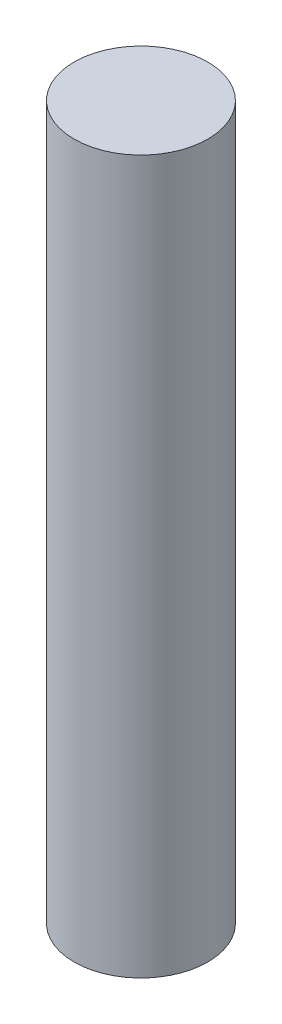
ISO-10303-21;
HEADER;
FILE_DESCRIPTION(('STEP AP214'),'2;1');
FILE_NAME('part.step','',(''),(''),'','','');
FILE_SCHEMA(('AUTOMOTIVE_DESIGN { 1 0 10303 214 1 1 1 1 }'));
ENDSEC;
DATA;
#1=APPLICATION_CONTEXT('core data for automotive mechanical design processes');
#2=APPLICATION_PROTOCOL_DEFINITION('international standard','automotive_design',2000,#1);
#3=PRODUCT_CONTEXT('',#1,'mechanical');
#4=PRODUCT('Part','Part','',(#3));
#5=PRODUCT_RELATED_PRODUCT_CATEGORY('part','',(#4));
#6=PRODUCT_DEFINITION_FORMATION('','',#4);
#7=PRODUCT_DEFINITION_CONTEXT('part definition',#1,'design');
#8=PRODUCT_DEFINITION('design','',#6,#7);
#9=PRODUCT_DEFINITION_SHAPE('','',#8);
#10=(LENGTH_UNIT() NAMED_UNIT(*) SI_UNIT(.MILLI.,.METRE.));
#11=(NAMED_UNIT(*) PLANE_ANGLE_UNIT() SI_UNIT($,.RADIAN.));
#12=(NAMED_UNIT(*) SI_UNIT($,.STERADIAN.) SOLID_ANGLE_UNIT());
#13=UNCERTAINTY_MEASURE_WITH_UNIT(LENGTH_MEASURE(1.E-05),#10,'distance_accuracy_value','');
#14=(GEOMETRIC_REPRESENTATION_CONTEXT(3) GLOBAL_UNCERTAINTY_ASSIGNED_CONTEXT((#13)) GLOBAL_UNIT_ASSIGNED_CONTEXT((#10,
#11,#12)) REPRESENTATION_CONTEXT('',''));
#15=CARTESIAN_POINT('',(0.,0.,0.));
#16=DIRECTION('',(0.,0.,1.));
#17=DIRECTION('',(1.,0.,0.));
#18=AXIS2_PLACEMENT_3D('',#15,#16,#17);
#19=CARTESIAN_POINT('',(0.,20.,0.));
#20=DIRECTION('',(0.,-1.,0.));
#21=DIRECTION('',(0.,0.,-1.));
#22=AXIS2_PLACEMENT_3D('',#19,#20,#21);
#23=CYLINDRICAL_SURFACE('',#22,1.875);
#24=CARTESIAN_POINT('',(0.,20.,0.));
#25=DIRECTION('',(0.,1.,0.));
#26=DIRECTION('',(0.,0.,1.));
#27=AXIS2_PLACEMENT_3D('',#24,#25,#26);
#28=CIRCLE('',#27,1.875);
#29=CARTESIAN_POINT('',(0.,20.,1.875));
#30=VERTEX_POINT('',#29);
#31=EDGE_CURVE('E10',#30,#30,#28,.T.);
#32=ORIENTED_EDGE('',*,*,#31,.F.);
#33=EDGE_LOOP('',(#32));
#34=FACE_BOUND('',#33,.T.);
#35=CARTESIAN_POINT('',(0.,0.,0.));
#36=DIRECTION('',(0.,1.,0.));
#37=DIRECTION('',(0.,0.,1.));
#38=AXIS2_PLACEMENT_3D('',#35,#36,#37);
#39=CIRCLE('',#38,1.875);
#40=CARTESIAN_POINT('',(0.,0.,1.875));
#41=VERTEX_POINT('',#40);
#42=EDGE_CURVE('E40',#41,#41,#39,.T.);
#43=ORIENTED_EDGE('',*,*,#42,.T.);
#44=EDGE_LOOP('',(#43));
#45=FACE_BOUND('',#44,.T.);
#46=ADVANCED_FACE('F37',(#34,#45),#23,.T.);
#47=CARTESIAN_POINT('',(0.,20.,0.));
#48=DIRECTION('',(0.,1.,0.));
#49=DIRECTION('',(0.,0.,1.));
#50=AXIS2_PLACEMENT_3D('',#47,#48,#49);
#51=PLANE('',#50);
#52=ORIENTED_EDGE('',*,*,#31,.T.);
#53=EDGE_LOOP('',(#52));
#54=FACE_BOUND('',#53,.T.);
#55=ADVANCED_FACE('F52',(#54),#51,.T.);
#56=CARTESIAN_POINT('',(0.,0.,0.));
#57=DIRECTION('',(0.,1.,0.));
#58=DIRECTION('',(0.,0.,1.));
#59=AXIS2_PLACEMENT_3D('',#56,#57,#58);
#60=PLANE('',#59);
#61=ORIENTED_EDGE('',*,*,#42,.F.);
#62=EDGE_LOOP('',(#61));
#63=FACE_BOUND('',#62,.T.);
#64=ADVANCED_FACE('F50',(#63),#60,.F.);
#65=CLOSED_SHELL('',(#46,#55,#64));
#66=MANIFOLD_SOLID_BREP('B2',#65);
#67=ADVANCED_BREP_SHAPE_REPRESENTATION('',(#18,#66),#14);
#68=SHAPE_DEFINITION_REPRESENTATION(#9,#67);
ENDSEC;
END-ISO-10303-21;
